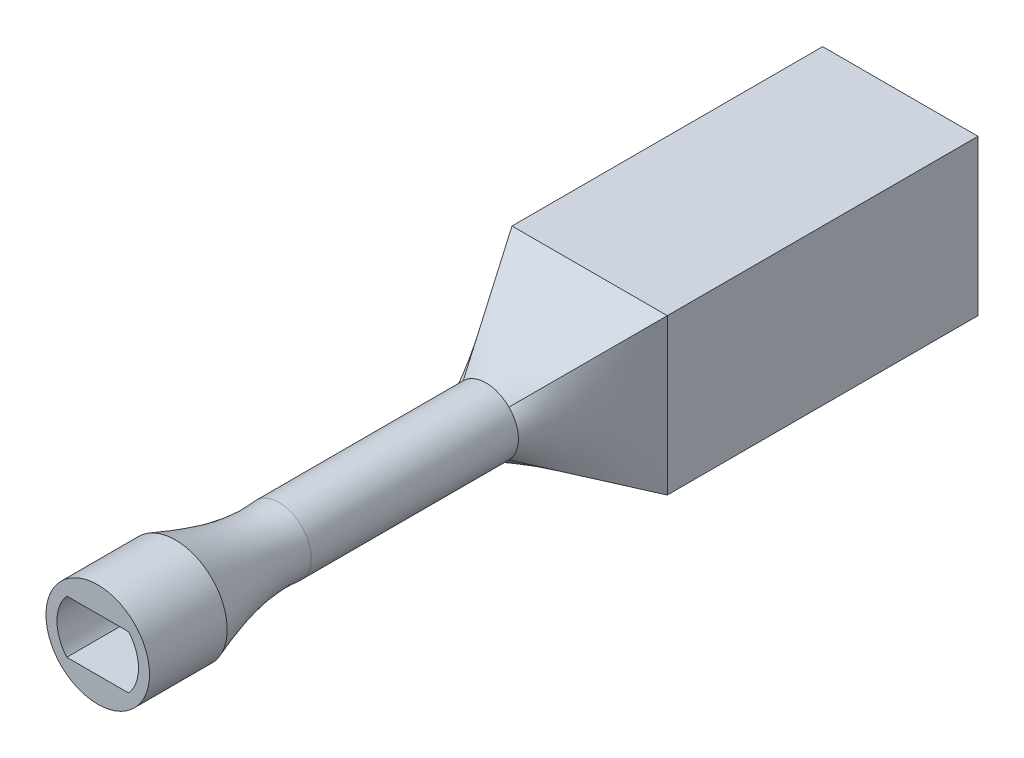
ISO-10303-21;
HEADER;
FILE_DESCRIPTION(('STEP AP214'),'2;1');
FILE_NAME('part.step','',(''),(''),'','','');
FILE_SCHEMA(('AUTOMOTIVE_DESIGN { 1 0 10303 214 1 1 1 1 }'));
ENDSEC;
DATA;
#1=APPLICATION_CONTEXT('core data for automotive mechanical design processes');
#2=APPLICATION_PROTOCOL_DEFINITION('international standard','automotive_design',2000,#1);
#3=PRODUCT_CONTEXT('',#1,'mechanical');
#4=PRODUCT('Part','Part','',(#3));
#5=PRODUCT_RELATED_PRODUCT_CATEGORY('part','',(#4));
#6=PRODUCT_DEFINITION_FORMATION('','',#4);
#7=PRODUCT_DEFINITION_CONTEXT('part definition',#1,'design');
#8=PRODUCT_DEFINITION('design','',#6,#7);
#9=PRODUCT_DEFINITION_SHAPE('','',#8);
#10=(LENGTH_UNIT() NAMED_UNIT(*) SI_UNIT(.MILLI.,.METRE.));
#11=(NAMED_UNIT(*) PLANE_ANGLE_UNIT() SI_UNIT($,.RADIAN.));
#12=(NAMED_UNIT(*) SI_UNIT($,.STERADIAN.) SOLID_ANGLE_UNIT());
#13=UNCERTAINTY_MEASURE_WITH_UNIT(LENGTH_MEASURE(1.E-05),#10,'distance_accuracy_value','');
#14=(GEOMETRIC_REPRESENTATION_CONTEXT(3) GLOBAL_UNCERTAINTY_ASSIGNED_CONTEXT((#13)) GLOBAL_UNIT_ASSIGNED_CONTEXT((#10,
#11,#12)) REPRESENTATION_CONTEXT('',''));
#15=CARTESIAN_POINT('',(0.,0.,0.));
#16=DIRECTION('',(0.,0.,1.));
#17=DIRECTION('',(1.,0.,0.));
#18=AXIS2_PLACEMENT_3D('',#15,#16,#17);
#19=CARTESIAN_POINT('',(0.,0.,38.1));
#20=DIRECTION('',(1.,0.,0.));
#21=DIRECTION('',(0.,0.,-1.));
#22=AXIS2_PLACEMENT_3D('',#19,#20,#21);
#23=PLANE('',#22);
#24=DIRECTION('',(0.,-1.,0.));
#25=VECTOR('',#24,1.);
#26=CARTESIAN_POINT('',(0.,0.,0.));
#27=LINE('',#26,#25);
#28=CARTESIAN_POINT('',(0.,19.05,0.));
#29=VERTEX_POINT('',#28);
#30=CARTESIAN_POINT('',(0.,0.,0.));
#31=VERTEX_POINT('',#30);
#32=EDGE_CURVE('E330',#29,#31,#27,.T.);
#33=ORIENTED_EDGE('',*,*,#32,.T.);
#34=DIRECTION('',(0.,0.,-1.));
#35=VECTOR('',#34,1.);
#36=CARTESIAN_POINT('',(0.,0.,38.1));
#37=LINE('',#36,#35);
#38=CARTESIAN_POINT('',(0.,0.,38.1));
#39=VERTEX_POINT('',#38);
#40=EDGE_CURVE('E12',#39,#31,#37,.T.);
#41=ORIENTED_EDGE('',*,*,#40,.F.);
#42=DIRECTION('',(0.,1.,0.));
#43=VECTOR('',#42,1.);
#44=CARTESIAN_POINT('',(0.,0.,38.1));
#45=LINE('',#44,#43);
#46=CARTESIAN_POINT('',(0.,19.05,38.1));
#47=VERTEX_POINT('',#46);
#48=EDGE_CURVE('E358',#47,#39,#45,.F.);
#49=ORIENTED_EDGE('',*,*,#48,.F.);
#50=DIRECTION('',(0.,0.,-1.));
#51=VECTOR('',#50,1.);
#52=CARTESIAN_POINT('',(0.,19.05,38.1));
#53=LINE('',#52,#51);
#54=EDGE_CURVE('E333',#47,#29,#53,.T.);
#55=ORIENTED_EDGE('',*,*,#54,.T.);
#56=EDGE_LOOP('',(#33,#41,#49,#55));
#57=FACE_BOUND('',#56,.T.);
#58=ADVANCED_FACE('F71',(#57),#23,.F.);
#59=CARTESIAN_POINT('',(0.,0.,38.1));
#60=DIRECTION('',(0.,1.,0.));
#61=DIRECTION('',(0.,0.,1.));
#62=AXIS2_PLACEMENT_3D('',#59,#60,#61);
#63=PLANE('',#62);
#64=DIRECTION('',(1.,0.,0.));
#65=VECTOR('',#64,1.);
#66=CARTESIAN_POINT('',(0.,0.,0.));
#67=LINE('',#66,#65);
#68=CARTESIAN_POINT('',(19.05,0.,0.));
#69=VERTEX_POINT('',#68);
#70=EDGE_CURVE('E337',#31,#69,#67,.T.);
#71=ORIENTED_EDGE('',*,*,#70,.T.);
#72=DIRECTION('',(0.,0.,-1.));
#73=VECTOR('',#72,1.);
#74=CARTESIAN_POINT('',(19.05,0.,38.1));
#75=LINE('',#74,#73);
#76=CARTESIAN_POINT('',(19.05,0.,38.1));
#77=VERTEX_POINT('',#76);
#78=EDGE_CURVE('E81',#77,#69,#75,.T.);
#79=ORIENTED_EDGE('',*,*,#78,.F.);
#80=DIRECTION('',(1.,0.,0.));
#81=VECTOR('',#80,1.);
#82=CARTESIAN_POINT('',(0.,0.,38.1));
#83=LINE('',#82,#81);
#84=EDGE_CURVE('E371',#39,#77,#83,.T.);
#85=ORIENTED_EDGE('',*,*,#84,.F.);
#86=ORIENTED_EDGE('',*,*,#40,.T.);
#87=EDGE_LOOP('',(#71,#79,#85,#86));
#88=FACE_BOUND('',#87,.T.);
#89=ADVANCED_FACE('F319',(#88),#63,.F.);
#90=CARTESIAN_POINT('',(19.05,0.,38.1));
#91=DIRECTION('',(-1.,0.,0.));
#92=DIRECTION('',(0.,0.,1.));
#93=AXIS2_PLACEMENT_3D('',#90,#91,#92);
#94=PLANE('',#93);
#95=DIRECTION('',(0.,1.,0.));
#96=VECTOR('',#95,1.);
#97=CARTESIAN_POINT('',(19.05,0.,0.));
#98=LINE('',#97,#96);
#99=CARTESIAN_POINT('',(19.05,19.05,0.));
#100=VERTEX_POINT('',#99);
#101=EDGE_CURVE('E342',#69,#100,#98,.T.);
#102=ORIENTED_EDGE('',*,*,#101,.T.);
#103=DIRECTION('',(0.,0.,-1.));
#104=VECTOR('',#103,1.);
#105=CARTESIAN_POINT('',(19.05,19.05,38.1));
#106=LINE('',#105,#104);
#107=CARTESIAN_POINT('',(19.05,19.05,38.1));
#108=VERTEX_POINT('',#107);
#109=EDGE_CURVE('E361',#108,#100,#106,.T.);
#110=ORIENTED_EDGE('',*,*,#109,.F.);
#111=DIRECTION('',(0.,1.,0.));
#112=VECTOR('',#111,1.);
#113=CARTESIAN_POINT('',(19.05,0.,38.1));
#114=LINE('',#113,#112);
#115=EDGE_CURVE('E375',#77,#108,#114,.T.);
#116=ORIENTED_EDGE('',*,*,#115,.F.);
#117=ORIENTED_EDGE('',*,*,#78,.T.);
#118=EDGE_LOOP('',(#102,#110,#116,#117));
#119=FACE_BOUND('',#118,.T.);
#120=ADVANCED_FACE('F324',(#119),#94,.F.);
#121=CARTESIAN_POINT('',(0.,19.05,38.1));
#122=DIRECTION('',(0.,-1.,0.));
#123=DIRECTION('',(0.,0.,-1.));
#124=AXIS2_PLACEMENT_3D('',#121,#122,#123);
#125=PLANE('',#124);
#126=DIRECTION('',(-1.,0.,0.));
#127=VECTOR('',#126,1.);
#128=CARTESIAN_POINT('',(0.,19.05,0.));
#129=LINE('',#128,#127);
#130=EDGE_CURVE('E355',#100,#29,#129,.T.);
#131=ORIENTED_EDGE('',*,*,#130,.T.);
#132=ORIENTED_EDGE('',*,*,#54,.F.);
#133=DIRECTION('',(1.,0.,0.));
#134=VECTOR('',#133,1.);
#135=CARTESIAN_POINT('',(0.,19.05,38.1));
#136=LINE('',#135,#134);
#137=EDGE_CURVE('E362',#108,#47,#136,.F.);
#138=ORIENTED_EDGE('',*,*,#137,.F.);
#139=ORIENTED_EDGE('',*,*,#109,.T.);
#140=EDGE_LOOP('',(#131,#132,#138,#139));
#141=FACE_BOUND('',#140,.T.);
#142=ADVANCED_FACE('F466',(#141),#125,.F.);
#143=CARTESIAN_POINT('',(0.,0.,0.));
#144=DIRECTION('',(0.,0.,-1.));
#145=DIRECTION('',(-1.,0.,0.));
#146=AXIS2_PLACEMENT_3D('',#143,#144,#145);
#147=PLANE('',#146);
#148=ORIENTED_EDGE('',*,*,#32,.F.);
#149=ORIENTED_EDGE('',*,*,#130,.F.);
#150=ORIENTED_EDGE('',*,*,#101,.F.);
#151=ORIENTED_EDGE('',*,*,#70,.F.);
#152=EDGE_LOOP('',(#148,#149,#150,#151));
#153=FACE_BOUND('',#152,.T.);
#154=ADVANCED_FACE('F444',(#153),#147,.T.);
#155=CARTESIAN_POINT('',(12.3313300378341,12.3313300378341,50.8));
#156=CARTESIAN_POINT('',(19.05,19.05,38.1));
#157=CARTESIAN_POINT('',(12.6620592045008,12.0006008711674,50.8));
#158=CARTESIAN_POINT('',(19.05,17.4625,38.1));
#159=CARTESIAN_POINT('',(12.9585981787103,11.5835090371438,50.8));
#160=CARTESIAN_POINT('',(19.05,15.875,38.1));
#161=CARTESIAN_POINT('',(13.3759779779088,10.6190861586301,50.8));
#162=CARTESIAN_POINT('',(19.05,12.7,38.1));
#163=CARTESIAN_POINT('',(13.49375,10.0729700252227,50.8));
#164=CARTESIAN_POINT('',(19.05,11.1125,38.1));
#165=CARTESIAN_POINT('',(13.49375,8.97702997477725,50.8));
#166=CARTESIAN_POINT('',(19.05,7.93749999999999,38.1));
#167=CARTESIAN_POINT('',(13.3759779779088,8.43091384136988,50.8));
#168=CARTESIAN_POINT('',(19.05,6.34999999999999,38.1));
#169=CARTESIAN_POINT('',(12.9585981787103,7.46649096285624,50.8));
#170=CARTESIAN_POINT('',(19.05,3.175,38.1));
#171=CARTESIAN_POINT('',(12.6620592045008,7.04939912883255,50.8));
#172=CARTESIAN_POINT('',(19.05,1.5875,38.1));
#173=CARTESIAN_POINT('',(12.3313300378341,6.71866996216589,50.8));
#174=CARTESIAN_POINT('',(19.05,0.,38.1));
#175=B_SPLINE_SURFACE_WITH_KNOTS('',3,1,((#155,#156),(#157,#158),(#159,#160),(#161,#162),(#163,
#164),(#165,#166),(#167,#168),(#169,#170),(#171,#172),(#173,#174)),.UNSPECIFIED.,.F.,.F.,.F.,(4,
2,2,2,4),(2,2),(0.,0.25,0.5,0.75,1.),(0.,1.),.UNSPECIFIED.);
#176=CARTESIAN_POINT('',(9.525,9.525,50.8));
#177=DIRECTION('',(0.,0.,1.));
#178=DIRECTION('',(1.,0.,0.));
#179=AXIS2_PLACEMENT_3D('',#176,#177,#178);
#180=CIRCLE('',#179,3.96875);
#181=CARTESIAN_POINT('',(12.3313300378341,6.71866996216589,50.8));
#182=VERTEX_POINT('',#181);
#183=CARTESIAN_POINT('',(12.3313300378341,12.3313300378341,50.8));
#184=VERTEX_POINT('',#183);
#185=EDGE_CURVE('E263',#182,#184,#180,.T.);
#186=DIRECTION('',(0.423597096817351,-0.423597096817351,-0.800706562440838));
#187=VECTOR('',#186,1.);
#188=CARTESIAN_POINT('',(15.6906650189171,3.35933498108294,44.45));
#189=LINE('',#188,#187);
#190=EDGE_CURVE('E399',#182,#77,#189,.T.);
#191=DIRECTION('',(-0.423597096817351,-0.423597096817351,0.800706562440838));
#192=VECTOR('',#191,1.);
#193=CARTESIAN_POINT('',(15.6906650189171,15.6906650189171,44.45));
#194=LINE('',#193,#192);
#195=EDGE_CURVE('E278',#108,#184,#194,.T.);
#196=ORIENTED_EDGE('',*,*,#185,.F.);
#197=ORIENTED_EDGE('',*,*,#190,.T.);
#198=ORIENTED_EDGE('',*,*,#115,.T.);
#199=ORIENTED_EDGE('',*,*,#195,.T.);
#200=EDGE_LOOP('',(#196,#197,#198,#199));
#201=FACE_BOUND('',#200,.T.);
#202=ADVANCED_FACE('F237',(#201),#175,.T.);
#203=CARTESIAN_POINT('',(12.3313300378341,6.71866996216589,50.8));
#204=CARTESIAN_POINT('',(19.05,0.,38.1));
#205=CARTESIAN_POINT('',(12.0006008711674,6.38794079549922,50.8));
#206=CARTESIAN_POINT('',(17.4625,0.,38.1));
#207=CARTESIAN_POINT('',(11.5835090371438,6.09140182128975,50.8));
#208=CARTESIAN_POINT('',(15.875,0.,38.1));
#209=CARTESIAN_POINT('',(10.6190861586301,5.67402202209115,50.8));
#210=CARTESIAN_POINT('',(12.7,0.,38.1));
#211=CARTESIAN_POINT('',(10.0729700252227,5.55625,50.8));
#212=CARTESIAN_POINT('',(11.1125,0.,38.1));
#213=CARTESIAN_POINT('',(8.97702997477727,5.55625,50.8));
#214=CARTESIAN_POINT('',(7.93749999999998,0.,38.1));
#215=CARTESIAN_POINT('',(8.43091384136989,5.67402202209115,50.8));
#216=CARTESIAN_POINT('',(6.34999999999998,0.,38.1));
#217=CARTESIAN_POINT('',(7.46649096285624,6.09140182128975,50.8));
#218=CARTESIAN_POINT('',(3.17499999999999,0.,38.1));
#219=CARTESIAN_POINT('',(7.04939912883256,6.38794079549922,50.8));
#220=CARTESIAN_POINT('',(1.58749999999999,0.,38.1));
#221=CARTESIAN_POINT('',(6.71866996216589,6.71866996216589,50.8));
#222=CARTESIAN_POINT('',(0.,0.,38.1));
#223=B_SPLINE_SURFACE_WITH_KNOTS('',3,1,((#203,#204),(#205,#206),(#207,#208),(#209,#210),(#211,
#212),(#213,#214),(#215,#216),(#217,#218),(#219,#220),(#221,#222)),.UNSPECIFIED.,.F.,.F.,.F.,(4,
2,2,2,4),(2,2),(0.,0.25,0.5,0.75,1.),(0.,1.),.UNSPECIFIED.);
#224=CARTESIAN_POINT('',(6.71866996216589,6.71866996216589,50.8));
#225=VERTEX_POINT('',#224);
#226=EDGE_CURVE('E261',#225,#182,#180,.T.);
#227=DIRECTION('',(-0.423597096817352,-0.423597096817351,-0.800706562440837));
#228=VECTOR('',#227,1.);
#229=CARTESIAN_POINT('',(3.35933498108295,3.35933498108294,44.45));
#230=LINE('',#229,#228);
#231=EDGE_CURVE('E345',#225,#39,#230,.T.);
#232=ORIENTED_EDGE('',*,*,#226,.F.);
#233=ORIENTED_EDGE('',*,*,#231,.T.);
#234=ORIENTED_EDGE('',*,*,#84,.T.);
#235=ORIENTED_EDGE('',*,*,#190,.F.);
#236=EDGE_LOOP('',(#232,#233,#234,#235));
#237=FACE_BOUND('',#236,.T.);
#238=ADVANCED_FACE('F414',(#237),#223,.T.);
#239=CARTESIAN_POINT('',(6.71866996216589,12.3313300378341,50.8));
#240=CARTESIAN_POINT('',(0.,19.05,38.1));
#241=CARTESIAN_POINT('',(7.04939912883256,12.6620592045008,50.8));
#242=CARTESIAN_POINT('',(1.5875,19.05,38.1));
#243=CARTESIAN_POINT('',(7.46649096285624,12.9585981787103,50.8));
#244=CARTESIAN_POINT('',(3.17499999999999,19.05,38.1));
#245=CARTESIAN_POINT('',(8.43091384136989,13.3759779779088,50.8));
#246=CARTESIAN_POINT('',(6.34999999999999,19.05,38.1));
#247=CARTESIAN_POINT('',(8.97702997477727,13.49375,50.8));
#248=CARTESIAN_POINT('',(7.93749999999999,19.05,38.1));
#249=CARTESIAN_POINT('',(10.0729700252227,13.49375,50.8));
#250=CARTESIAN_POINT('',(11.1125,19.05,38.1));
#251=CARTESIAN_POINT('',(10.6190861586301,13.3759779779088,50.8));
#252=CARTESIAN_POINT('',(12.7,19.05,38.1));
#253=CARTESIAN_POINT('',(11.5835090371438,12.9585981787103,50.8));
#254=CARTESIAN_POINT('',(15.875,19.05,38.1));
#255=CARTESIAN_POINT('',(12.0006008711675,12.6620592045008,50.8));
#256=CARTESIAN_POINT('',(17.4625,19.05,38.1));
#257=CARTESIAN_POINT('',(12.3313300378341,12.3313300378341,50.8));
#258=CARTESIAN_POINT('',(19.05,19.05,38.1));
#259=B_SPLINE_SURFACE_WITH_KNOTS('',3,1,((#239,#240),(#241,#242),(#243,#244),(#245,#246),(#247,
#248),(#249,#250),(#251,#252),(#253,#254),(#255,#256),(#257,#258)),.UNSPECIFIED.,.F.,.F.,.F.,(4,
2,2,2,4),(2,2),(0.,0.25,0.5,0.75,1.),(0.,1.),.UNSPECIFIED.);
#260=CARTESIAN_POINT('',(6.71866996216589,12.3313300378341,50.8));
#261=VERTEX_POINT('',#260);
#262=EDGE_CURVE('E275',#184,#261,#180,.T.);
#263=DIRECTION('',(-0.423597096817352,0.423597096817351,-0.800706562440837));
#264=VECTOR('',#263,1.);
#265=CARTESIAN_POINT('',(3.35933498108295,15.6906650189171,44.45));
#266=LINE('',#265,#264);
#267=EDGE_CURVE('E338',#261,#47,#266,.T.);
#268=ORIENTED_EDGE('',*,*,#262,.F.);
#269=ORIENTED_EDGE('',*,*,#195,.F.);
#270=ORIENTED_EDGE('',*,*,#137,.T.);
#271=ORIENTED_EDGE('',*,*,#267,.F.);
#272=EDGE_LOOP('',(#268,#269,#270,#271));
#273=FACE_BOUND('',#272,.T.);
#274=ADVANCED_FACE('F384',(#273),#259,.T.);
#275=CARTESIAN_POINT('',(6.71866996216589,6.71866996216589,50.8));
#276=CARTESIAN_POINT('',(0.,0.,38.1));
#277=CARTESIAN_POINT('',(6.38794079549923,7.04939912883255,50.8));
#278=CARTESIAN_POINT('',(0.,1.5875,38.1));
#279=CARTESIAN_POINT('',(6.09140182128975,7.46649096285624,50.8));
#280=CARTESIAN_POINT('',(0.,3.175,38.1));
#281=CARTESIAN_POINT('',(5.67402202209116,8.43091384136989,50.8));
#282=CARTESIAN_POINT('',(0.,6.35,38.1));
#283=CARTESIAN_POINT('',(5.55625000000001,8.97702997477726,50.8));
#284=CARTESIAN_POINT('',(0.,7.9375,38.1));
#285=CARTESIAN_POINT('',(5.55625,10.0729700252227,50.8));
#286=CARTESIAN_POINT('',(0.,11.1125,38.1));
#287=CARTESIAN_POINT('',(5.67402202209116,10.6190861586301,50.8));
#288=CARTESIAN_POINT('',(0.,12.7,38.1));
#289=CARTESIAN_POINT('',(6.09140182128975,11.5835090371438,50.8));
#290=CARTESIAN_POINT('',(0.,15.875,38.1));
#291=CARTESIAN_POINT('',(6.38794079549923,12.0006008711674,50.8));
#292=CARTESIAN_POINT('',(0.,17.4625,38.1));
#293=CARTESIAN_POINT('',(6.71866996216589,12.3313300378341,50.8));
#294=CARTESIAN_POINT('',(0.,19.05,38.1));
#295=B_SPLINE_SURFACE_WITH_KNOTS('',3,1,((#275,#276),(#277,#278),(#279,#280),(#281,#282),(#283,
#284),(#285,#286),(#287,#288),(#289,#290),(#291,#292),(#293,#294)),.UNSPECIFIED.,.F.,.F.,.F.,(4,
2,2,2,4),(2,2),(0.,0.25,0.5,0.75,1.),(0.,1.),.UNSPECIFIED.);
#296=EDGE_CURVE('E270',#261,#225,#180,.T.);
#297=ORIENTED_EDGE('',*,*,#296,.F.);
#298=ORIENTED_EDGE('',*,*,#267,.T.);
#299=ORIENTED_EDGE('',*,*,#48,.T.);
#300=ORIENTED_EDGE('',*,*,#231,.F.);
#301=EDGE_LOOP('',(#297,#298,#299,#300));
#302=FACE_BOUND('',#301,.T.);
#303=ADVANCED_FACE('F235',(#302),#295,.T.);
#304=CARTESIAN_POINT('',(9.525,9.525,76.2));
#305=DIRECTION('',(0.,0.,-1.));
#306=DIRECTION('',(-1.,0.,0.));
#307=AXIS2_PLACEMENT_3D('',#304,#305,#306);
#308=CYLINDRICAL_SURFACE('',#307,3.96875);
#309=CARTESIAN_POINT('',(9.525,9.525,76.2));
#310=DIRECTION('',(0.,0.,-1.));
#311=DIRECTION('',(-1.,0.,0.));
#312=AXIS2_PLACEMENT_3D('',#309,#310,#311);
#313=CIRCLE('',#312,3.96875);
#314=CARTESIAN_POINT('',(11.6662801208287,12.8665409628858,76.2));
#315=VERTEX_POINT('',#314);
#316=EDGE_CURVE('E281',#315,#315,#313,.F.);
#317=ORIENTED_EDGE('',*,*,#316,.F.);
#318=EDGE_LOOP('',(#317));
#319=FACE_BOUND('',#318,.T.);
#320=ORIENTED_EDGE('',*,*,#262,.T.);
#321=ORIENTED_EDGE('',*,*,#296,.T.);
#322=ORIENTED_EDGE('',*,*,#226,.T.);
#323=ORIENTED_EDGE('',*,*,#185,.T.);
#324=EDGE_LOOP('',(#320,#321,#322,#323));
#325=FACE_BOUND('',#324,.T.);
#326=ADVANCED_FACE('F223',(#319,#325),#308,.T.);
#327=CARTESIAN_POINT('',(11.6662801208287,12.8665409628858,76.2));
#328=CARTESIAN_POINT('',(6.20713411405373,14.9392650436485,88.9));
#329=CARTESIAN_POINT('',(4.98319819505711,17.1491012045432,76.2));
#330=CARTESIAN_POINT('',(-4.62139597324324,8.30353327175594,88.9));
#331=CARTESIAN_POINT('',(0.70063795339969,10.4660192787716,76.2));
#332=CARTESIAN_POINT('',(2.01433579864931,-2.52499681554103,88.9));
#333=CARTESIAN_POINT('',(7.38371987917129,6.1834590371142,76.2));
#334=CARTESIAN_POINT('',(12.8428658859463,4.11073495635151,88.9));
#335=CARTESIAN_POINT('',(14.0668018049429,1.90089879545677,76.2));
#336=CARTESIAN_POINT('',(23.6713959732432,10.7464667282441,88.9));
#337=CARTESIAN_POINT('',(18.3493620466003,8.58398072122838,76.2));
#338=CARTESIAN_POINT('',(17.0356642013507,21.574996815541,88.9));
#339=CARTESIAN_POINT('',(11.6662801208287,12.8665409628858,76.2));
#340=CARTESIAN_POINT('',(6.20713411405373,14.9392650436485,88.9));
#341=(BOUNDED_SURFACE() B_SPLINE_SURFACE(3,1,((#327,#328),(#329,#330),(#331,#332),(#333,#334),
(#335,#336),(#337,#338),(#339,#340)),.UNSPECIFIED.,.T.,.F.,.F.) B_SPLINE_SURFACE_WITH_KNOTS((4,
3,4),(2,2),(0.,0.5,1.),(0.,1.),
.UNSPECIFIED.) GEOMETRIC_REPRESENTATION_ITEM() RATIONAL_B_SPLINE_SURFACE(((1.,1.),
(0.333333333333333,0.333333333333334),(0.333333333333333,0.333333333333334),(1.,1.),
(0.333333333333333,0.333333333333333),(0.333333333333333,0.333333333333333),(1.,1.))) REPRESENTATION_ITEM('') SURFACE());
#342=CARTESIAN_POINT('',(9.525,9.525,88.9));
#343=DIRECTION('',(0.,0.,1.));
#344=DIRECTION('',(1.,0.,0.));
#345=AXIS2_PLACEMENT_3D('',#342,#343,#344);
#346=CIRCLE('',#345,6.35);
#347=CARTESIAN_POINT('',(6.20713411405373,14.9392650436485,88.9));
#348=VERTEX_POINT('',#347);
#349=EDGE_CURVE('E74',#348,#348,#346,.T.);
#350=CARTESIAN_POINT('',(11.6662801208287,12.8665409628858,76.2));
#351=CARTESIAN_POINT('',(11.6094140165915,12.8881318387271,76.3322916666667));
#352=CARTESIAN_POINT('',(11.5525479123542,12.9097227145684,76.4645833333333));
#353=CARTESIAN_POINT('',(11.4388157038798,12.9529044662509,76.7291666666667));
#354=CARTESIAN_POINT('',(11.3819495996425,12.9744953420922,76.8614583333333));
#355=CARTESIAN_POINT('',(11.268217391168,13.0176770937747,77.1260416666667));
#356=CARTESIAN_POINT('',(11.2113512869308,13.039267969616,77.2583333333333));
#357=CARTESIAN_POINT('',(11.0976190784563,13.0824497212986,77.5229166666666));
#358=CARTESIAN_POINT('',(11.0407529742191,13.1040405971399,77.6552083333333));
#359=CARTESIAN_POINT('',(10.9270207657446,13.1472223488224,77.9197916666667));
#360=CARTESIAN_POINT('',(10.8701546615074,13.1688132246637,78.0520833333333));
#361=CARTESIAN_POINT('',(10.7564224530329,13.2119949763462,78.3166666666667));
#362=CARTESIAN_POINT('',(10.6995563487956,13.2335858521875,78.4489583333333));
#363=CARTESIAN_POINT('',(10.5858241403212,13.2767676038701,78.7135416666667));
#364=CARTESIAN_POINT('',(10.5289580360839,13.2983584797114,78.8458333333333));
#365=CARTESIAN_POINT('',(10.4152258276094,13.3415402313939,79.1104166666667));
#366=CARTESIAN_POINT('',(10.3583597233722,13.3631311072352,79.2427083333333));
#367=CARTESIAN_POINT('',(10.2446275148977,13.4063128589177,79.5072916666667));
#368=CARTESIAN_POINT('',(10.1877614106605,13.427903734759,79.6395833333333));
#369=CARTESIAN_POINT('',(10.074029202186,13.4710854864416,79.9041666666667));
#370=CARTESIAN_POINT('',(10.0171630979488,13.4926763622829,80.0364583333333));
#371=CARTESIAN_POINT('',(9.90343088947429,13.5358581139654,80.3010416666667));
#372=CARTESIAN_POINT('',(9.84656478523705,13.5574489898067,80.4333333333333));
#373=CARTESIAN_POINT('',(9.73283257676257,13.6006307414893,80.6979166666667));
#374=CARTESIAN_POINT('',(9.67596647252534,13.6222216173305,80.8302083333333));
#375=CARTESIAN_POINT('',(9.56223426405086,13.6654033690131,81.0947916666667));
#376=CARTESIAN_POINT('',(9.50536815981362,13.6869942448544,81.2270833333333));
#377=CARTESIAN_POINT('',(9.39163595133914,13.7301759965369,81.4916666666667));
#378=CARTESIAN_POINT('',(9.3347698471019,13.7517668723782,81.6239583333333));
#379=CARTESIAN_POINT('',(9.22103763862742,13.7949486240608,81.8885416666667));
#380=CARTESIAN_POINT('',(9.16417153439018,13.816539499902,82.0208333333333));
#381=CARTESIAN_POINT('',(9.0504393259157,13.8597212515846,82.2854166666666));
#382=CARTESIAN_POINT('',(8.99357322167846,13.8813121274259,82.4177083333333));
#383=CARTESIAN_POINT('',(8.87984101320398,13.9244938791084,82.6822916666667));
#384=CARTESIAN_POINT('',(8.82297490896674,13.9460847549497,82.8145833333333));
#385=CARTESIAN_POINT('',(8.70924270049226,13.9892665066323,83.0791666666667));
#386=CARTESIAN_POINT('',(8.65237659625503,14.0108573824735,83.2114583333333));
#387=CARTESIAN_POINT('',(8.53864438778055,14.0540391341561,83.4760416666667));
#388=CARTESIAN_POINT('',(8.48177828354331,14.0756300099974,83.6083333333333));
#389=CARTESIAN_POINT('',(8.36804607506883,14.1188117616799,83.8729166666667));
#390=CARTESIAN_POINT('',(8.31117997083159,14.1404026375212,84.0052083333333));
#391=CARTESIAN_POINT('',(8.19744776235711,14.1835843892038,84.2697916666667));
#392=CARTESIAN_POINT('',(8.14058165811987,14.205175265045,84.4020833333333));
#393=CARTESIAN_POINT('',(8.02684944964539,14.2483570167276,84.6666666666667));
#394=CARTESIAN_POINT('',(7.96998334540815,14.2699478925689,84.7989583333333));
#395=CARTESIAN_POINT('',(7.85625113693367,14.3131296442514,85.0635416666667));
#396=CARTESIAN_POINT('',(7.79938503269643,14.3347205200927,85.1958333333333));
#397=CARTESIAN_POINT('',(7.68565282422195,14.3779022717753,85.4604166666667));
#398=CARTESIAN_POINT('',(7.62878671998472,14.3994931476165,85.5927083333333));
#399=CARTESIAN_POINT('',(7.51505451151024,14.4426748992991,85.8572916666667));
#400=CARTESIAN_POINT('',(7.45818840727299,14.4642657751404,85.9895833333333));
#401=CARTESIAN_POINT('',(7.34445619879852,14.5074475268229,86.2541666666667));
#402=CARTESIAN_POINT('',(7.28759009456128,14.5290384026642,86.3864583333333));
#403=CARTESIAN_POINT('',(7.1738578860868,14.5722201543468,86.6510416666667));
#404=CARTESIAN_POINT('',(7.11699178184956,14.593811030188,86.7833333333333));
#405=CARTESIAN_POINT('',(7.00325957337508,14.6369927818706,87.0479166666667));
#406=CARTESIAN_POINT('',(6.94639346913784,14.6585836577119,87.1802083333333));
#407=CARTESIAN_POINT('',(6.83266126066336,14.7017654093944,87.4447916666667));
#408=CARTESIAN_POINT('',(6.77579515642612,14.7233562852357,87.5770833333333));
#409=CARTESIAN_POINT('',(6.66206294795164,14.7665380369183,87.8416666666667));
#410=CARTESIAN_POINT('',(6.60519684371441,14.7881289127595,87.9739583333333));
#411=CARTESIAN_POINT('',(6.49146463523993,14.8313106644421,88.2385416666667));
#412=CARTESIAN_POINT('',(6.43459853100269,14.8529015402834,88.3708333333333));
#413=CARTESIAN_POINT('',(6.32086632252821,14.8960832919659,88.6354166666667));
#414=CARTESIAN_POINT('',(6.26400021829097,14.9176741678072,88.7677083333333));
#415=CARTESIAN_POINT('',(6.20713411405373,14.9392650436485,88.9));
#416=B_SPLINE_CURVE_WITH_KNOTS('',3,(#350,#351,#352,#353,#354,#355,#356,#357,#358,#359,#360,
#361,#362,#363,#364,#365,#366,#367,#368,#369,#370,#371,#372,#373,#374,#375,#376,#377,#378,#379,
#380,#381,#382,#383,#384,#385,#386,#387,#388,#389,#390,#391,#392,#393,#394,#395,#396,#397,#398,
#399,#400,#401,#402,#403,#404,#405,#406,#407,#408,#409,#410,#411,#412,#413,#414,#415),
.UNSPECIFIED.,.F.,.F.,(4,2,2,2,2,2,2,2,2,2,2,2,2,2,2,2,2,2,2,2,2,2,2,2,2,2,2,2,2,2,2,2,4),(0.,
0.436816944727915,0.873633889455817,1.31045083418373,1.74726777891164,2.18408472363956,
2.62090166836747,3.05771861309538,3.49453555782328,3.9313525025512,4.3681694472791,
4.80498639200701,5.24180333673493,5.67862028146283,6.11543722619076,6.55225417091866,
6.98907111564656,7.42588806037448,7.8627050051024,8.2995219498303,8.73633889455821,
9.17315583928613,9.60997278401403,10.0467897287419,10.4836066734699,10.9204236181978,
11.3572405629257,11.7940575076536,12.2308744523815,12.6676913971094,13.1045083418373,
13.5413252865652,13.9781422312931),.UNSPECIFIED.);
#417=EDGE_CURVE('BSEAM211',#315,#348,#416,.T.);
#418=ORIENTED_EDGE('',*,*,#316,.T.);
#419=ORIENTED_EDGE('',*,*,#349,.F.);
#420=ORIENTED_EDGE('',*,*,#417,.T.);
#421=ORIENTED_EDGE('',*,*,#417,.F.);
#422=EDGE_LOOP('',(#418,#420,#419,#421));
#423=FACE_BOUND('',#422,.T.);
#424=ADVANCED_FACE('F211',(#423),#341,.T.);
#425=CARTESIAN_POINT('',(9.525,9.525,98.425));
#426=DIRECTION('',(0.,0.,1.));
#427=DIRECTION('',(1.,0.,0.));
#428=AXIS2_PLACEMENT_3D('',#425,#426,#427);
#429=PLANE('',#428);
#430=CARTESIAN_POINT('',(9.525,9.525,98.425));
#431=DIRECTION('',(0.,0.,1.));
#432=DIRECTION('',(1.,0.,0.));
#433=AXIS2_PLACEMENT_3D('',#430,#431,#432);
#434=CIRCLE('',#433,6.35);
#435=CARTESIAN_POINT('',(15.875,9.525,98.425));
#436=VERTEX_POINT('',#435);
#437=EDGE_CURVE('E167',#436,#436,#434,.T.);
#438=ORIENTED_EDGE('',*,*,#437,.T.);
#439=EDGE_LOOP('',(#438));
#440=FACE_BOUND('',#439,.T.);
#441=DIRECTION('',(1.,0.,0.));
#442=VECTOR('',#441,1.);
#443=CARTESIAN_POINT('',(5.72532896160735,6.27499999999999,98.425));
#444=LINE('',#443,#442);
#445=CARTESIAN_POINT('',(5.72532896160735,6.27499999999999,98.425));
#446=VERTEX_POINT('',#445);
#447=CARTESIAN_POINT('',(13.3246710383927,6.27499999999999,98.425));
#448=VERTEX_POINT('',#447);
#449=EDGE_CURVE('E160',#446,#448,#444,.T.);
#450=ORIENTED_EDGE('',*,*,#449,.F.);
#451=CARTESIAN_POINT('',(9.525,9.525,98.425));
#452=DIRECTION('',(0.,0.,1.));
#453=DIRECTION('',(1.,0.,0.));
#454=AXIS2_PLACEMENT_3D('',#451,#452,#453);
#455=CIRCLE('',#454,5.);
#456=CARTESIAN_POINT('',(5.72532896160734,12.775,98.425));
#457=VERTEX_POINT('',#456);
#458=EDGE_CURVE('E150',#457,#446,#455,.T.);
#459=ORIENTED_EDGE('',*,*,#458,.F.);
#460=DIRECTION('',(-1.,0.,0.));
#461=VECTOR('',#460,1.);
#462=CARTESIAN_POINT('',(5.72532896160734,12.775,98.425));
#463=LINE('',#462,#461);
#464=CARTESIAN_POINT('',(13.3246710383927,12.775,98.425));
#465=VERTEX_POINT('',#464);
#466=EDGE_CURVE('E177',#465,#457,#463,.T.);
#467=ORIENTED_EDGE('',*,*,#466,.F.);
#468=CARTESIAN_POINT('',(9.525,9.525,98.425));
#469=DIRECTION('',(0.,0.,1.));
#470=DIRECTION('',(1.,0.,0.));
#471=AXIS2_PLACEMENT_3D('',#468,#469,#470);
#472=CIRCLE('',#471,5.);
#473=EDGE_CURVE('E173',#448,#465,#472,.T.);
#474=ORIENTED_EDGE('',*,*,#473,.F.);
#475=EDGE_LOOP('',(#450,#459,#467,#474));
#476=FACE_BOUND('',#475,.T.);
#477=ADVANCED_FACE('F171',(#440,#476),#429,.T.);
#478=CARTESIAN_POINT('',(9.525,9.525,98.425));
#479=DIRECTION('',(0.,0.,-1.));
#480=DIRECTION('',(-1.,0.,0.));
#481=AXIS2_PLACEMENT_3D('',#478,#479,#480);
#482=CYLINDRICAL_SURFACE('',#481,6.35);
#483=ORIENTED_EDGE('',*,*,#437,.F.);
#484=EDGE_LOOP('',(#483));
#485=FACE_BOUND('',#484,.T.);
#486=ORIENTED_EDGE('',*,*,#349,.T.);
#487=EDGE_LOOP('',(#486));
#488=FACE_BOUND('',#487,.T.);
#489=ADVANCED_FACE('F290',(#485,#488),#482,.T.);
#490=CARTESIAN_POINT('',(9.525,9.525,98.425));
#491=DIRECTION('',(0.,0.,-1.));
#492=DIRECTION('',(-1.,0.,0.));
#493=AXIS2_PLACEMENT_3D('',#490,#491,#492);
#494=CYLINDRICAL_SURFACE('',#493,5.);
#495=CARTESIAN_POINT('',(9.525,9.525,88.9));
#496=DIRECTION('',(0.,0.,1.));
#497=DIRECTION('',(1.,0.,0.));
#498=AXIS2_PLACEMENT_3D('',#495,#496,#497);
#499=CIRCLE('',#498,5.);
#500=CARTESIAN_POINT('',(5.72532896160734,12.775,88.9));
#501=VERTEX_POINT('',#500);
#502=CARTESIAN_POINT('',(5.72532896160735,6.27499999999999,88.9));
#503=VERTEX_POINT('',#502);
#504=EDGE_CURVE('E89',#501,#503,#499,.T.);
#505=ORIENTED_EDGE('',*,*,#504,.F.);
#506=DIRECTION('',(0.,0.,-1.));
#507=VECTOR('',#506,1.);
#508=CARTESIAN_POINT('',(5.72532896160734,12.775,98.425));
#509=LINE('',#508,#507);
#510=EDGE_CURVE('E155',#457,#501,#509,.T.);
#511=ORIENTED_EDGE('',*,*,#510,.F.);
#512=ORIENTED_EDGE('',*,*,#458,.T.);
#513=DIRECTION('',(0.,0.,-1.));
#514=VECTOR('',#513,1.);
#515=CARTESIAN_POINT('',(5.72532896160735,6.27499999999999,98.425));
#516=LINE('',#515,#514);
#517=EDGE_CURVE('E153',#446,#503,#516,.T.);
#518=ORIENTED_EDGE('',*,*,#517,.T.);
#519=EDGE_LOOP('',(#505,#511,#512,#518));
#520=FACE_BOUND('',#519,.T.);
#521=ADVANCED_FACE('F152',(#520),#494,.F.);
#522=CARTESIAN_POINT('',(5.72532896160735,6.27499999999999,98.425));
#523=DIRECTION('',(0.,1.,0.));
#524=DIRECTION('',(0.,0.,1.));
#525=AXIS2_PLACEMENT_3D('',#522,#523,#524);
#526=PLANE('',#525);
#527=DIRECTION('',(1.,0.,0.));
#528=VECTOR('',#527,1.);
#529=CARTESIAN_POINT('',(5.72532896160735,6.27499999999999,88.9));
#530=LINE('',#529,#528);
#531=CARTESIAN_POINT('',(13.3246710383927,6.27499999999999,88.9));
#532=VERTEX_POINT('',#531);
#533=EDGE_CURVE('E93',#503,#532,#530,.T.);
#534=ORIENTED_EDGE('',*,*,#533,.F.);
#535=ORIENTED_EDGE('',*,*,#517,.F.);
#536=ORIENTED_EDGE('',*,*,#449,.T.);
#537=DIRECTION('',(0.,0.,-1.));
#538=VECTOR('',#537,1.);
#539=CARTESIAN_POINT('',(13.3246710383927,6.27499999999999,98.425));
#540=LINE('',#539,#538);
#541=EDGE_CURVE('E168',#448,#532,#540,.T.);
#542=ORIENTED_EDGE('',*,*,#541,.T.);
#543=EDGE_LOOP('',(#534,#535,#536,#542));
#544=FACE_BOUND('',#543,.T.);
#545=ADVANCED_FACE('F164',(#544),#526,.T.);
#546=CARTESIAN_POINT('',(9.525,9.525,98.425));
#547=DIRECTION('',(0.,0.,-1.));
#548=DIRECTION('',(-1.,0.,0.));
#549=AXIS2_PLACEMENT_3D('',#546,#547,#548);
#550=CYLINDRICAL_SURFACE('',#549,5.);
#551=CARTESIAN_POINT('',(9.525,9.525,88.9));
#552=DIRECTION('',(0.,0.,1.));
#553=DIRECTION('',(1.,0.,0.));
#554=AXIS2_PLACEMENT_3D('',#551,#552,#553);
#555=CIRCLE('',#554,5.);
#556=CARTESIAN_POINT('',(13.3246710383927,12.775,88.9));
#557=VERTEX_POINT('',#556);
#558=EDGE_CURVE('E186',#532,#557,#555,.T.);
#559=ORIENTED_EDGE('',*,*,#558,.F.);
#560=ORIENTED_EDGE('',*,*,#541,.F.);
#561=ORIENTED_EDGE('',*,*,#473,.T.);
#562=DIRECTION('',(0.,0.,-1.));
#563=VECTOR('',#562,1.);
#564=CARTESIAN_POINT('',(13.3246710383927,12.775,98.425));
#565=LINE('',#564,#563);
#566=EDGE_CURVE('E193',#465,#557,#565,.T.);
#567=ORIENTED_EDGE('',*,*,#566,.T.);
#568=EDGE_LOOP('',(#559,#560,#561,#567));
#569=FACE_BOUND('',#568,.T.);
#570=ADVANCED_FACE('F307',(#569),#550,.F.);
#571=CARTESIAN_POINT('',(5.72532896160734,12.775,98.425));
#572=DIRECTION('',(0.,-1.,0.));
#573=DIRECTION('',(0.,0.,-1.));
#574=AXIS2_PLACEMENT_3D('',#571,#572,#573);
#575=PLANE('',#574);
#576=DIRECTION('',(-1.,0.,0.));
#577=VECTOR('',#576,1.);
#578=CARTESIAN_POINT('',(5.72532896160734,12.775,88.9));
#579=LINE('',#578,#577);
#580=EDGE_CURVE('E161',#557,#501,#579,.T.);
#581=ORIENTED_EDGE('',*,*,#580,.F.);
#582=ORIENTED_EDGE('',*,*,#566,.F.);
#583=ORIENTED_EDGE('',*,*,#466,.T.);
#584=ORIENTED_EDGE('',*,*,#510,.T.);
#585=EDGE_LOOP('',(#581,#582,#583,#584));
#586=FACE_BOUND('',#585,.T.);
#587=ADVANCED_FACE('F310',(#586),#575,.T.);
#588=CARTESIAN_POINT('',(9.525,9.525,88.9));
#589=DIRECTION('',(0.,0.,1.));
#590=DIRECTION('',(1.,0.,0.));
#591=AXIS2_PLACEMENT_3D('',#588,#589,#590);
#592=PLANE('',#591);
#593=ORIENTED_EDGE('',*,*,#504,.T.);
#594=ORIENTED_EDGE('',*,*,#533,.T.);
#595=ORIENTED_EDGE('',*,*,#558,.T.);
#596=ORIENTED_EDGE('',*,*,#580,.T.);
#597=EDGE_LOOP('',(#593,#594,#595,#596));
#598=FACE_BOUND('',#597,.T.);
#599=ADVANCED_FACE('F225',(#598),#592,.T.);
#600=CLOSED_SHELL('',(#58,#89,#120,#142,#154,#202,#238,#274,#303,#326,#424,#477,#489,#521,#545,
#570,#587,#599));
#601=MANIFOLD_SOLID_BREP('B2',#600);
#602=ADVANCED_BREP_SHAPE_REPRESENTATION('',(#18,#601),#14);
#603=SHAPE_DEFINITION_REPRESENTATION(#9,#602);
ENDSEC;
END-ISO-10303-21;
